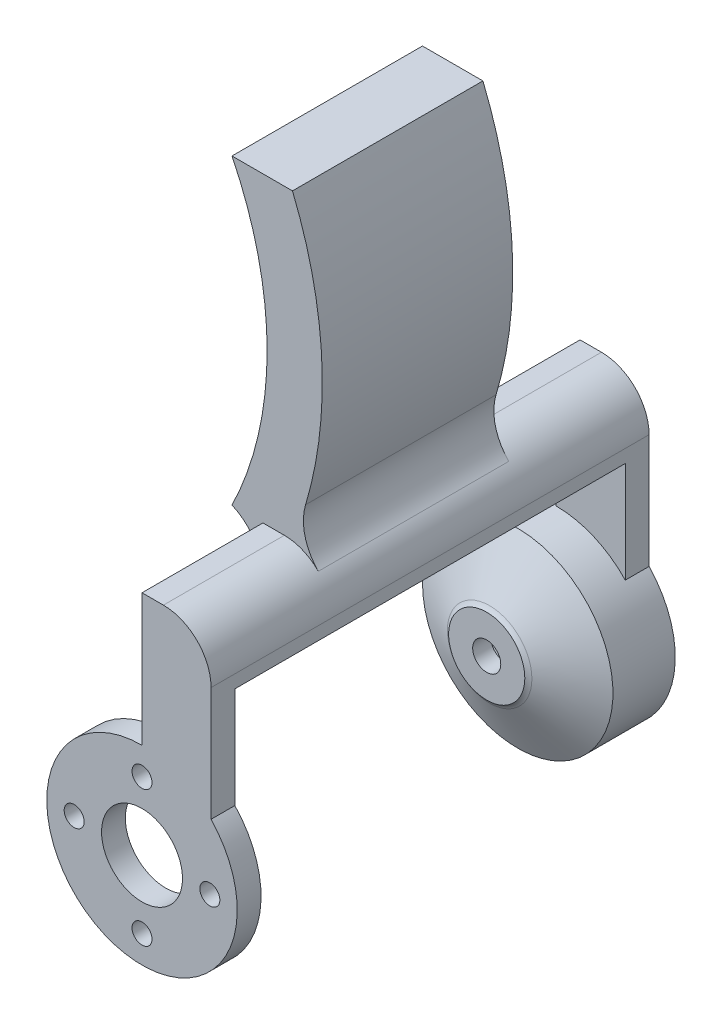
ISO-10303-21;
HEADER;
FILE_DESCRIPTION(('STEP AP214'),'2;1');
FILE_NAME('part.step','',(''),(''),'','','');
FILE_SCHEMA(('AUTOMOTIVE_DESIGN { 1 0 10303 214 1 1 1 1 }'));
ENDSEC;
DATA;
#1=APPLICATION_CONTEXT('core data for automotive mechanical design processes');
#2=APPLICATION_PROTOCOL_DEFINITION('international standard','automotive_design',2000,#1);
#3=PRODUCT_CONTEXT('',#1,'mechanical');
#4=PRODUCT('Part','Part','',(#3));
#5=PRODUCT_RELATED_PRODUCT_CATEGORY('part','',(#4));
#6=PRODUCT_DEFINITION_FORMATION('','',#4);
#7=PRODUCT_DEFINITION_CONTEXT('part definition',#1,'design');
#8=PRODUCT_DEFINITION('design','',#6,#7);
#9=PRODUCT_DEFINITION_SHAPE('','',#8);
#10=(LENGTH_UNIT() NAMED_UNIT(*) SI_UNIT(.MILLI.,.METRE.));
#11=(NAMED_UNIT(*) PLANE_ANGLE_UNIT() SI_UNIT($,.RADIAN.));
#12=(NAMED_UNIT(*) SI_UNIT($,.STERADIAN.) SOLID_ANGLE_UNIT());
#13=UNCERTAINTY_MEASURE_WITH_UNIT(LENGTH_MEASURE(1.E-05),#10,'distance_accuracy_value','');
#14=(GEOMETRIC_REPRESENTATION_CONTEXT(3) GLOBAL_UNCERTAINTY_ASSIGNED_CONTEXT((#13)) GLOBAL_UNIT_ASSIGNED_CONTEXT((#10,
#11,#12)) REPRESENTATION_CONTEXT('',''));
#15=CARTESIAN_POINT('',(0.,0.,0.));
#16=DIRECTION('',(0.,0.,1.));
#17=DIRECTION('',(1.,0.,0.));
#18=AXIS2_PLACEMENT_3D('',#15,#16,#17);
#19=CARTESIAN_POINT('',(0.,-15.875,23.));
#20=DIRECTION('',(0.,1.,0.));
#21=DIRECTION('',(-1.,0.,0.));
#22=AXIS2_PLACEMENT_3D('',#19,#20,#21);
#23=PLANE('',#22);
#24=DIRECTION('',(1.,0.,0.));
#25=VECTOR('',#24,1.);
#26=CARTESIAN_POINT('',(0.,-15.875,23.));
#27=LINE('',#26,#25);
#28=CARTESIAN_POINT('',(0.,-15.875,23.));
#29=VERTEX_POINT('',#28);
#30=CARTESIAN_POINT('',(2.25,-15.875,23.));
#31=VERTEX_POINT('',#30);
#32=EDGE_CURVE('E303',#29,#31,#27,.T.);
#33=ORIENTED_EDGE('',*,*,#32,.T.);
#34=DIRECTION('',(0.,0.,1.));
#35=VECTOR('',#34,1.);
#36=CARTESIAN_POINT('',(2.25,-15.875,23.));
#37=LINE('',#36,#35);
#38=CARTESIAN_POINT('',(2.25,-15.875,10.3));
#39=VERTEX_POINT('',#38);
#40=EDGE_CURVE('E379',#31,#39,#37,.F.);
#41=ORIENTED_EDGE('',*,*,#40,.T.);
#42=DIRECTION('',(1.,0.,0.));
#43=VECTOR('',#42,1.);
#44=CARTESIAN_POINT('',(-3.25,-15.875,10.3));
#45=LINE('',#44,#43);
#46=CARTESIAN_POINT('',(0.,-15.875,10.3));
#47=VERTEX_POINT('',#46);
#48=EDGE_CURVE('E204',#47,#39,#45,.T.);
#49=ORIENTED_EDGE('',*,*,#48,.F.);
#50=DIRECTION('',(0.,0.,-1.));
#51=VECTOR('',#50,1.);
#52=CARTESIAN_POINT('',(0.,-15.875,10.));
#53=LINE('',#52,#51);
#54=EDGE_CURVE('E351',#29,#47,#53,.T.);
#55=ORIENTED_EDGE('',*,*,#54,.F.);
#56=EDGE_LOOP('',(#33,#41,#49,#55));
#57=FACE_BOUND('',#56,.T.);
#58=ADVANCED_FACE('F49',(#57),#23,.T.);
#59=CARTESIAN_POINT('',(0.,-39.7417,-23.));
#60=DIRECTION('',(0.,0.,1.));
#61=DIRECTION('',(1.,0.,0.));
#62=AXIS2_PLACEMENT_3D('',#59,#60,#61);
#63=CYLINDRICAL_SURFACE('',#62,1.475);
#64=CARTESIAN_POINT('',(0.,-39.7417,-13.2));
#65=DIRECTION('',(0.,0.,1.));
#66=DIRECTION('',(1.,0.,0.));
#67=AXIS2_PLACEMENT_3D('',#64,#65,#66);
#68=CIRCLE('',#67,1.475);
#69=CARTESIAN_POINT('',(1.475,-39.7417,-13.2));
#70=VERTEX_POINT('',#69);
#71=EDGE_CURVE('E228',#70,#70,#68,.T.);
#72=ORIENTED_EDGE('',*,*,#71,.T.);
#73=EDGE_LOOP('',(#72));
#74=FACE_BOUND('',#73,.T.);
#75=CARTESIAN_POINT('',(0.,-39.7417,-15.1));
#76=DIRECTION('',(0.,0.,-1.));
#77=DIRECTION('',(-1.,0.,0.));
#78=AXIS2_PLACEMENT_3D('',#75,#76,#77);
#79=CIRCLE('',#78,1.475);
#80=CARTESIAN_POINT('',(-1.475,-39.7417,-15.1));
#81=VERTEX_POINT('',#80);
#82=EDGE_CURVE('E182',#81,#81,#79,.F.);
#83=ORIENTED_EDGE('',*,*,#82,.F.);
#84=EDGE_LOOP('',(#83));
#85=FACE_BOUND('',#84,.T.);
#86=ADVANCED_FACE('F507',(#74,#85),#63,.F.);
#87=CARTESIAN_POINT('',(-25.,-49.7417,-20.5));
#88=DIRECTION('',(0.,0.,-1.));
#89=DIRECTION('',(-1.,0.,0.));
#90=AXIS2_PLACEMENT_3D('',#87,#88,#89);
#91=PLANE('',#90);
#92=CARTESIAN_POINT('',(0.,-39.7417,-20.5));
#93=DIRECTION('',(0.,0.,1.));
#94=DIRECTION('',(1.,0.,0.));
#95=AXIS2_PLACEMENT_3D('',#92,#93,#94);
#96=CIRCLE('',#95,9.99999999999999);
#97=CARTESIAN_POINT('',(7.24999999999999,-32.854211343022,-20.5));
#98=VERTEX_POINT('',#97);
#99=CARTESIAN_POINT('',(0.,-29.7417,-20.5));
#100=VERTEX_POINT('',#99);
#101=EDGE_CURVE('E236',#98,#100,#96,.T.);
#102=ORIENTED_EDGE('',*,*,#101,.F.);
#103=DIRECTION('',(0.,1.,0.));
#104=VECTOR('',#103,1.);
#105=CARTESIAN_POINT('',(7.25,0.,-20.5));
#106=LINE('',#105,#104);
#107=CARTESIAN_POINT('',(7.25,-22.2417,-20.5));
#108=VERTEX_POINT('',#107);
#109=EDGE_CURVE('E274',#98,#108,#106,.T.);
#110=ORIENTED_EDGE('',*,*,#109,.T.);
#111=DIRECTION('',(1.,0.,0.));
#112=VECTOR('',#111,1.);
#113=CARTESIAN_POINT('',(-25.,-22.2417,-20.5));
#114=LINE('',#113,#112);
#115=CARTESIAN_POINT('',(0.,-22.2417,-20.5));
#116=VERTEX_POINT('',#115);
#117=EDGE_CURVE('E239',#116,#108,#114,.T.);
#118=ORIENTED_EDGE('',*,*,#117,.F.);
#119=DIRECTION('',(0.,1.,0.));
#120=VECTOR('',#119,1.);
#121=CARTESIAN_POINT('',(0.,0.,-20.5));
#122=LINE('',#121,#120);
#123=EDGE_CURVE('E278',#100,#116,#122,.T.);
#124=ORIENTED_EDGE('',*,*,#123,.F.);
#125=EDGE_LOOP('',(#102,#110,#118,#124));
#126=FACE_BOUND('',#125,.T.);
#127=ADVANCED_FACE('F463',(#126),#91,.F.);
#128=CARTESIAN_POINT('',(0.,-39.7417,23.));
#129=DIRECTION('',(0.,0.,-1.));
#130=DIRECTION('',(-1.,0.,0.));
#131=AXIS2_PLACEMENT_3D('',#128,#129,#130);
#132=CYLINDRICAL_SURFACE('',#131,10.);
#133=CARTESIAN_POINT('',(0.,-39.7417,-16.4558261025671));
#134=DIRECTION('',(0.,0.,-1.));
#135=DIRECTION('',(-1.,0.,0.));
#136=AXIS2_PLACEMENT_3D('',#133,#134,#135);
#137=CIRCLE('',#136,10.);
#138=CARTESIAN_POINT('',(-10.,-39.7417,-16.4558261025671));
#139=VERTEX_POINT('',#138);
#140=EDGE_CURVE('E207',#139,#139,#137,.T.);
#141=ORIENTED_EDGE('',*,*,#140,.T.);
#142=EDGE_LOOP('',(#141));
#143=FACE_BOUND('',#142,.T.);
#144=DIRECTION('',(0.,0.,-1.));
#145=VECTOR('',#144,1.);
#146=CARTESIAN_POINT('',(7.25,-32.854211343022,23.));
#147=LINE('',#146,#145);
#148=CARTESIAN_POINT('',(7.25,-32.854211343022,-23.));
#149=VERTEX_POINT('',#148);
#150=EDGE_CURVE('E323',#98,#149,#147,.T.);
#151=ORIENTED_EDGE('',*,*,#150,.F.);
#152=ORIENTED_EDGE('',*,*,#101,.T.);
#153=DIRECTION('',(0.,0.,-1.));
#154=VECTOR('',#153,1.);
#155=CARTESIAN_POINT('',(0.,-29.7417,23.));
#156=LINE('',#155,#154);
#157=CARTESIAN_POINT('',(0.,-29.7417,-23.));
#158=VERTEX_POINT('',#157);
#159=EDGE_CURVE('E345',#100,#158,#156,.T.);
#160=ORIENTED_EDGE('',*,*,#159,.T.);
#161=CARTESIAN_POINT('',(0.,-39.7417,-23.));
#162=DIRECTION('',(0.,0.,1.));
#163=DIRECTION('',(1.,0.,0.));
#164=AXIS2_PLACEMENT_3D('',#161,#162,#163);
#165=CIRCLE('',#164,10.);
#166=EDGE_CURVE('E327',#158,#149,#165,.T.);
#167=ORIENTED_EDGE('',*,*,#166,.T.);
#168=EDGE_LOOP('',(#151,#152,#160,#167));
#169=FACE_BOUND('',#168,.T.);
#170=ADVANCED_FACE('F456',(#143,#169),#132,.T.);
#171=CARTESIAN_POINT('',(0.,-39.7417,23.));
#172=DIRECTION('',(0.,0.,-1.));
#173=DIRECTION('',(-1.,0.,0.));
#174=AXIS2_PLACEMENT_3D('',#171,#172,#173);
#175=CYLINDRICAL_SURFACE('',#174,4.25000000000001);
#176=CARTESIAN_POINT('',(0.,-39.7417,-23.));
#177=DIRECTION('',(0.,0.,1.));
#178=DIRECTION('',(1.,0.,0.));
#179=AXIS2_PLACEMENT_3D('',#176,#177,#178);
#180=CIRCLE('',#179,4.25000000000001);
#181=CARTESIAN_POINT('',(4.25000000000001,-39.7417,-23.));
#182=VERTEX_POINT('',#181);
#183=EDGE_CURVE('E292',#182,#182,#180,.T.);
#184=ORIENTED_EDGE('',*,*,#183,.F.);
#185=EDGE_LOOP('',(#184));
#186=FACE_BOUND('',#185,.T.);
#187=CARTESIAN_POINT('',(0.,-39.7417,-15.1));
#188=DIRECTION('',(0.,0.,-1.));
#189=DIRECTION('',(-1.,0.,0.));
#190=AXIS2_PLACEMENT_3D('',#187,#188,#189);
#191=CIRCLE('',#190,4.25000000000001);
#192=CARTESIAN_POINT('',(-4.25,-39.7417,-15.1));
#193=VERTEX_POINT('',#192);
#194=EDGE_CURVE('E198',#193,#193,#191,.F.);
#195=ORIENTED_EDGE('',*,*,#194,.T.);
#196=EDGE_LOOP('',(#195));
#197=FACE_BOUND('',#196,.T.);
#198=ADVANCED_FACE('F493',(#186,#197),#175,.F.);
#199=DIRECTION('',(1.,0.,0.));
#200=VECTOR('',#199,1.);
#201=CARTESIAN_POINT('',(-3.25,-15.875,-9.7));
#202=LINE('',#201,#200);
#203=CARTESIAN_POINT('',(0.,-15.875,-9.7));
#204=VERTEX_POINT('',#203);
#205=CARTESIAN_POINT('',(2.25,-15.875,-9.7));
#206=VERTEX_POINT('',#205);
#207=EDGE_CURVE('E208',#204,#206,#202,.T.);
#208=ORIENTED_EDGE('',*,*,#207,.T.);
#209=DIRECTION('',(0.,0.,1.));
#210=VECTOR('',#209,1.);
#211=CARTESIAN_POINT('',(2.25,-15.875,23.));
#212=LINE('',#211,#210);
#213=CARTESIAN_POINT('',(2.25,-15.875,-23.));
#214=VERTEX_POINT('',#213);
#215=EDGE_CURVE('E376',#206,#214,#212,.F.);
#216=ORIENTED_EDGE('',*,*,#215,.T.);
#217=DIRECTION('',(1.,0.,0.));
#218=VECTOR('',#217,1.);
#219=CARTESIAN_POINT('',(0.,-15.875,-23.));
#220=LINE('',#219,#218);
#221=CARTESIAN_POINT('',(0.,-15.875,-23.));
#222=VERTEX_POINT('',#221);
#223=EDGE_CURVE('E334',#222,#214,#220,.T.);
#224=ORIENTED_EDGE('',*,*,#223,.F.);
#225=EDGE_CURVE('E350',#204,#222,#53,.T.);
#226=ORIENTED_EDGE('',*,*,#225,.F.);
#227=EDGE_LOOP('',(#208,#216,#224,#226));
#228=FACE_BOUND('',#227,.T.);
#229=ADVANCED_FACE('F437',(#228),#23,.T.);
#230=CARTESIAN_POINT('',(0.,0.,23.));
#231=DIRECTION('',(1.,0.,0.));
#232=DIRECTION('',(0.,1.,0.));
#233=AXIS2_PLACEMENT_3D('',#230,#231,#232);
#234=PLANE('',#233);
#235=DIRECTION('',(0.,0.,1.));
#236=VECTOR('',#235,1.);
#237=CARTESIAN_POINT('',(0.,-20.8612310415784,23.));
#238=LINE('',#237,#236);
#239=CARTESIAN_POINT('',(0.,-20.8612310415784,10.3));
#240=VERTEX_POINT('',#239);
#241=CARTESIAN_POINT('',(0.,-20.8612310415784,-9.7));
#242=VERTEX_POINT('',#241);
#243=EDGE_CURVE('E400',#240,#242,#238,.F.);
#244=ORIENTED_EDGE('',*,*,#243,.T.);
#245=DIRECTION('',(0.,1.,0.));
#246=VECTOR('',#245,1.);
#247=CARTESIAN_POINT('',(0.,0.,-9.7));
#248=LINE('',#247,#246);
#249=EDGE_CURVE('E404',#242,#204,#248,.T.);
#250=ORIENTED_EDGE('',*,*,#249,.T.);
#251=ORIENTED_EDGE('',*,*,#225,.T.);
#252=DIRECTION('',(0.,-1.,0.));
#253=VECTOR('',#252,1.);
#254=CARTESIAN_POINT('',(0.,0.,-23.));
#255=LINE('',#254,#253);
#256=EDGE_CURVE('E286',#222,#158,#255,.T.);
#257=ORIENTED_EDGE('',*,*,#256,.T.);
#258=ORIENTED_EDGE('',*,*,#159,.F.);
#259=ORIENTED_EDGE('',*,*,#123,.T.);
#260=DIRECTION('',(0.,0.,1.));
#261=VECTOR('',#260,1.);
#262=CARTESIAN_POINT('',(0.,-22.2417,23.));
#263=LINE('',#262,#261);
#264=CARTESIAN_POINT('',(0.,-22.2417,20.5));
#265=VERTEX_POINT('',#264);
#266=EDGE_CURVE('E282',#116,#265,#263,.T.);
#267=ORIENTED_EDGE('',*,*,#266,.T.);
#268=DIRECTION('',(0.,-1.,0.));
#269=VECTOR('',#268,1.);
#270=CARTESIAN_POINT('',(0.,0.,20.5));
#271=LINE('',#270,#269);
#272=CARTESIAN_POINT('',(0.,-29.7417,20.5));
#273=VERTEX_POINT('',#272);
#274=EDGE_CURVE('E270',#265,#273,#271,.T.);
#275=ORIENTED_EDGE('',*,*,#274,.T.);
#276=CARTESIAN_POINT('',(0.,-29.7417,23.));
#277=VERTEX_POINT('',#276);
#278=EDGE_CURVE('E346',#277,#273,#156,.T.);
#279=ORIENTED_EDGE('',*,*,#278,.F.);
#280=DIRECTION('',(0.,-1.,0.));
#281=VECTOR('',#280,1.);
#282=CARTESIAN_POINT('',(0.,0.,23.));
#283=LINE('',#282,#281);
#284=EDGE_CURVE('E291',#29,#277,#283,.T.);
#285=ORIENTED_EDGE('',*,*,#284,.F.);
#286=ORIENTED_EDGE('',*,*,#54,.T.);
#287=DIRECTION('',(0.,-1.,0.));
#288=VECTOR('',#287,1.);
#289=CARTESIAN_POINT('',(0.,0.,10.3));
#290=LINE('',#289,#288);
#291=EDGE_CURVE('E64',#47,#240,#290,.T.);
#292=ORIENTED_EDGE('',*,*,#291,.T.);
#293=EDGE_LOOP('',(#244,#250,#251,#257,#258,#259,#267,#275,#279,#285,#286,#292));
#294=FACE_BOUND('',#293,.T.);
#295=ADVANCED_FACE('F421',(#294),#234,.F.);
#296=CARTESIAN_POINT('',(0.,-39.7417,20.5));
#297=DIRECTION('',(0.,0.,1.));
#298=DIRECTION('',(0.,-1.,0.));
#299=AXIS2_PLACEMENT_3D('',#296,#297,#298);
#300=CIRCLE('',#299,10.);
#301=CARTESIAN_POINT('',(7.25,-32.854211343022,20.5));
#302=VERTEX_POINT('',#301);
#303=EDGE_CURVE('E267',#273,#302,#300,.T.);
#304=ORIENTED_EDGE('',*,*,#303,.T.);
#305=CARTESIAN_POINT('',(7.25,-32.854211343022,23.));
#306=VERTEX_POINT('',#305);
#307=EDGE_CURVE('E341',#306,#302,#147,.T.);
#308=ORIENTED_EDGE('',*,*,#307,.F.);
#309=CARTESIAN_POINT('',(0.,-39.7417,23.));
#310=DIRECTION('',(0.,0.,1.));
#311=DIRECTION('',(1.,0.,0.));
#312=AXIS2_PLACEMENT_3D('',#309,#310,#311);
#313=CIRCLE('',#312,10.);
#314=EDGE_CURVE('E296',#277,#306,#313,.T.);
#315=ORIENTED_EDGE('',*,*,#314,.F.);
#316=ORIENTED_EDGE('',*,*,#278,.T.);
#317=EDGE_LOOP('',(#304,#308,#315,#316));
#318=FACE_BOUND('',#317,.T.);
#319=ADVANCED_FACE('F472',(#318),#132,.T.);
#320=CARTESIAN_POINT('',(7.25,0.,23.));
#321=DIRECTION('',(1.,0.,0.));
#322=DIRECTION('',(0.,1.,0.));
#323=AXIS2_PLACEMENT_3D('',#320,#321,#322);
#324=PLANE('',#323);
#325=DIRECTION('',(0.,-1.,0.));
#326=VECTOR('',#325,1.);
#327=CARTESIAN_POINT('',(7.25,0.,-23.));
#328=LINE('',#327,#326);
#329=CARTESIAN_POINT('',(7.25,-20.875,-23.));
#330=VERTEX_POINT('',#329);
#331=EDGE_CURVE('E331',#330,#149,#328,.T.);
#332=ORIENTED_EDGE('',*,*,#331,.F.);
#333=DIRECTION('',(0.,0.,1.));
#334=VECTOR('',#333,1.);
#335=CARTESIAN_POINT('',(7.25,-20.875,23.));
#336=LINE('',#335,#334);
#337=CARTESIAN_POINT('',(7.25,-20.875,23.));
#338=VERTEX_POINT('',#337);
#339=EDGE_CURVE('E369',#330,#338,#336,.T.);
#340=ORIENTED_EDGE('',*,*,#339,.T.);
#341=DIRECTION('',(0.,-1.,0.));
#342=VECTOR('',#341,1.);
#343=CARTESIAN_POINT('',(7.25,0.,23.));
#344=LINE('',#343,#342);
#345=EDGE_CURVE('E300',#338,#306,#344,.T.);
#346=ORIENTED_EDGE('',*,*,#345,.T.);
#347=ORIENTED_EDGE('',*,*,#307,.T.);
#348=DIRECTION('',(0.,-1.,0.));
#349=VECTOR('',#348,1.);
#350=CARTESIAN_POINT('',(7.25,0.,20.5));
#351=LINE('',#350,#349);
#352=CARTESIAN_POINT('',(7.25,-22.2417,20.5));
#353=VERTEX_POINT('',#352);
#354=EDGE_CURVE('E263',#353,#302,#351,.T.);
#355=ORIENTED_EDGE('',*,*,#354,.F.);
#356=DIRECTION('',(0.,0.,1.));
#357=VECTOR('',#356,1.);
#358=CARTESIAN_POINT('',(7.25,-22.2417,23.));
#359=LINE('',#358,#357);
#360=EDGE_CURVE('E220',#108,#353,#359,.T.);
#361=ORIENTED_EDGE('',*,*,#360,.F.);
#362=ORIENTED_EDGE('',*,*,#109,.F.);
#363=ORIENTED_EDGE('',*,*,#150,.T.);
#364=EDGE_LOOP('',(#332,#340,#346,#347,#355,#361,#362,#363));
#365=FACE_BOUND('',#364,.T.);
#366=ADVANCED_FACE('F449',(#365),#324,.T.);
#367=CARTESIAN_POINT('',(7.125,-39.7417,23.));
#368=DIRECTION('',(0.,0.,-1.));
#369=DIRECTION('',(-1.,0.,0.));
#370=AXIS2_PLACEMENT_3D('',#367,#368,#369);
#371=CYLINDRICAL_SURFACE('',#370,1.05);
#372=CARTESIAN_POINT('',(7.125,-39.7417,20.5));
#373=DIRECTION('',(0.,0.,1.));
#374=DIRECTION('',(0.,-1.,0.));
#375=AXIS2_PLACEMENT_3D('',#372,#373,#374);
#376=CIRCLE('',#375,1.05);
#377=CARTESIAN_POINT('',(7.125,-40.7917,20.5));
#378=VERTEX_POINT('',#377);
#379=EDGE_CURVE('E259',#378,#378,#376,.T.);
#380=ORIENTED_EDGE('',*,*,#379,.F.);
#381=EDGE_LOOP('',(#380));
#382=FACE_BOUND('',#381,.T.);
#383=CARTESIAN_POINT('',(7.125,-39.7417,23.));
#384=DIRECTION('',(0.,0.,1.));
#385=DIRECTION('',(1.,0.,0.));
#386=AXIS2_PLACEMENT_3D('',#383,#384,#385);
#387=CIRCLE('',#386,1.05);
#388=CARTESIAN_POINT('',(8.175,-39.7417,23.));
#389=VERTEX_POINT('',#388);
#390=EDGE_CURVE('E315',#389,#389,#387,.T.);
#391=ORIENTED_EDGE('',*,*,#390,.T.);
#392=EDGE_LOOP('',(#391));
#393=FACE_BOUND('',#392,.T.);
#394=ADVANCED_FACE('F716',(#382,#393),#371,.F.);
#395=CARTESIAN_POINT('',(0.,-46.8667,23.));
#396=DIRECTION('',(0.,0.,-1.));
#397=DIRECTION('',(-1.,0.,0.));
#398=AXIS2_PLACEMENT_3D('',#395,#396,#397);
#399=CYLINDRICAL_SURFACE('',#398,1.05);
#400=CARTESIAN_POINT('',(0.,-46.8667,20.5));
#401=DIRECTION('',(0.,0.,1.));
#402=DIRECTION('',(0.,-1.,0.));
#403=AXIS2_PLACEMENT_3D('',#400,#401,#402);
#404=CIRCLE('',#403,1.05);
#405=CARTESIAN_POINT('',(0.,-47.9167,20.5));
#406=VERTEX_POINT('',#405);
#407=EDGE_CURVE('E255',#406,#406,#404,.T.);
#408=ORIENTED_EDGE('',*,*,#407,.F.);
#409=EDGE_LOOP('',(#408));
#410=FACE_BOUND('',#409,.T.);
#411=CARTESIAN_POINT('',(0.,-46.8667,23.));
#412=DIRECTION('',(0.,0.,1.));
#413=DIRECTION('',(1.,0.,0.));
#414=AXIS2_PLACEMENT_3D('',#411,#412,#413);
#415=CIRCLE('',#414,1.05);
#416=CARTESIAN_POINT('',(1.05000000000001,-46.8667,23.));
#417=VERTEX_POINT('',#416);
#418=EDGE_CURVE('E311',#417,#417,#415,.T.);
#419=ORIENTED_EDGE('',*,*,#418,.T.);
#420=EDGE_LOOP('',(#419));
#421=FACE_BOUND('',#420,.T.);
#422=ADVANCED_FACE('F708',(#410,#421),#399,.F.);
#423=CARTESIAN_POINT('',(-7.12499999999999,-39.7417,23.));
#424=DIRECTION('',(0.,0.,-1.));
#425=DIRECTION('',(-1.,0.,0.));
#426=AXIS2_PLACEMENT_3D('',#423,#424,#425);
#427=CYLINDRICAL_SURFACE('',#426,1.05);
#428=CARTESIAN_POINT('',(-7.12499999999999,-39.7417,20.5));
#429=DIRECTION('',(0.,0.,1.));
#430=DIRECTION('',(0.,-1.,0.));
#431=AXIS2_PLACEMENT_3D('',#428,#429,#430);
#432=CIRCLE('',#431,1.05);
#433=CARTESIAN_POINT('',(-7.12499999999999,-40.7917,20.5));
#434=VERTEX_POINT('',#433);
#435=EDGE_CURVE('E251',#434,#434,#432,.T.);
#436=ORIENTED_EDGE('',*,*,#435,.F.);
#437=EDGE_LOOP('',(#436));
#438=FACE_BOUND('',#437,.T.);
#439=CARTESIAN_POINT('',(-7.12499999999999,-39.7417,23.));
#440=DIRECTION('',(0.,0.,1.));
#441=DIRECTION('',(1.,0.,0.));
#442=AXIS2_PLACEMENT_3D('',#439,#440,#441);
#443=CIRCLE('',#442,1.05);
#444=CARTESIAN_POINT('',(-6.07499999999999,-39.7417,23.));
#445=VERTEX_POINT('',#444);
#446=EDGE_CURVE('E307',#445,#445,#443,.T.);
#447=ORIENTED_EDGE('',*,*,#446,.T.);
#448=EDGE_LOOP('',(#447));
#449=FACE_BOUND('',#448,.T.);
#450=ADVANCED_FACE('F498',(#438,#449),#427,.F.);
#451=CARTESIAN_POINT('',(0.,-32.6167,23.));
#452=DIRECTION('',(0.,0.,-1.));
#453=DIRECTION('',(-1.,0.,0.));
#454=AXIS2_PLACEMENT_3D('',#451,#452,#453);
#455=CYLINDRICAL_SURFACE('',#454,1.05);
#456=CARTESIAN_POINT('',(0.,-32.6167,20.5));
#457=DIRECTION('',(0.,0.,1.));
#458=DIRECTION('',(0.,-1.,0.));
#459=AXIS2_PLACEMENT_3D('',#456,#457,#458);
#460=CIRCLE('',#459,1.05);
#461=CARTESIAN_POINT('',(0.,-33.6667,20.5));
#462=VERTEX_POINT('',#461);
#463=EDGE_CURVE('E247',#462,#462,#460,.T.);
#464=ORIENTED_EDGE('',*,*,#463,.F.);
#465=EDGE_LOOP('',(#464));
#466=FACE_BOUND('',#465,.T.);
#467=CARTESIAN_POINT('',(0.,-32.6167,23.));
#468=DIRECTION('',(0.,0.,1.));
#469=DIRECTION('',(1.,0.,0.));
#470=AXIS2_PLACEMENT_3D('',#467,#468,#469);
#471=CIRCLE('',#470,1.05);
#472=CARTESIAN_POINT('',(1.05000000000001,-32.6167,23.));
#473=VERTEX_POINT('',#472);
#474=EDGE_CURVE('E287',#473,#473,#471,.T.);
#475=ORIENTED_EDGE('',*,*,#474,.T.);
#476=EDGE_LOOP('',(#475));
#477=FACE_BOUND('',#476,.T.);
#478=ADVANCED_FACE('F490',(#466,#477),#455,.F.);
#479=CARTESIAN_POINT('',(0.,-39.7417,20.5));
#480=DIRECTION('',(0.,0.,1.));
#481=DIRECTION('',(0.,-1.,0.));
#482=AXIS2_PLACEMENT_3D('',#479,#480,#481);
#483=CIRCLE('',#482,4.25000000000001);
#484=CARTESIAN_POINT('',(0.,-43.9917,20.5));
#485=VERTEX_POINT('',#484);
#486=EDGE_CURVE('E244',#485,#485,#483,.T.);
#487=ORIENTED_EDGE('',*,*,#486,.F.);
#488=EDGE_LOOP('',(#487));
#489=FACE_BOUND('',#488,.T.);
#490=CARTESIAN_POINT('',(0.,-39.7417,23.));
#491=DIRECTION('',(0.,0.,1.));
#492=DIRECTION('',(1.,0.,0.));
#493=AXIS2_PLACEMENT_3D('',#490,#491,#492);
#494=CIRCLE('',#493,4.25000000000001);
#495=CARTESIAN_POINT('',(4.25000000000001,-39.7417,23.));
#496=VERTEX_POINT('',#495);
#497=EDGE_CURVE('E319',#496,#496,#494,.T.);
#498=ORIENTED_EDGE('',*,*,#497,.T.);
#499=EDGE_LOOP('',(#498));
#500=FACE_BOUND('',#499,.T.);
#501=ADVANCED_FACE('F477',(#489,#500),#175,.F.);
#502=CARTESIAN_POINT('',(0.,0.,23.));
#503=DIRECTION('',(0.,0.,1.));
#504=DIRECTION('',(1.,0.,0.));
#505=AXIS2_PLACEMENT_3D('',#502,#503,#504);
#506=PLANE('',#505);
#507=ORIENTED_EDGE('',*,*,#345,.F.);
#508=CARTESIAN_POINT('',(2.25,-20.875,23.));
#509=DIRECTION('',(0.,0.,1.));
#510=DIRECTION('',(1.,0.,0.));
#511=AXIS2_PLACEMENT_3D('',#508,#509,#510);
#512=CIRCLE('',#511,5.);
#513=EDGE_CURVE('E373',#338,#31,#512,.T.);
#514=ORIENTED_EDGE('',*,*,#513,.T.);
#515=ORIENTED_EDGE('',*,*,#32,.F.);
#516=ORIENTED_EDGE('',*,*,#284,.T.);
#517=ORIENTED_EDGE('',*,*,#314,.T.);
#518=EDGE_LOOP('',(#507,#514,#515,#516,#517));
#519=FACE_BOUND('',#518,.T.);
#520=ORIENTED_EDGE('',*,*,#474,.F.);
#521=EDGE_LOOP('',(#520));
#522=FACE_BOUND('',#521,.T.);
#523=ORIENTED_EDGE('',*,*,#446,.F.);
#524=EDGE_LOOP('',(#523));
#525=FACE_BOUND('',#524,.T.);
#526=ORIENTED_EDGE('',*,*,#418,.F.);
#527=EDGE_LOOP('',(#526));
#528=FACE_BOUND('',#527,.T.);
#529=ORIENTED_EDGE('',*,*,#390,.F.);
#530=EDGE_LOOP('',(#529));
#531=FACE_BOUND('',#530,.T.);
#532=ORIENTED_EDGE('',*,*,#497,.F.);
#533=EDGE_LOOP('',(#532));
#534=FACE_BOUND('',#533,.T.);
#535=ADVANCED_FACE('F474',(#519,#522,#525,#528,#531,#534),#506,.T.);
#536=CARTESIAN_POINT('',(0.,0.,-23.));
#537=DIRECTION('',(0.,0.,1.));
#538=DIRECTION('',(1.,0.,0.));
#539=AXIS2_PLACEMENT_3D('',#536,#537,#538);
#540=PLANE('',#539);
#541=ORIENTED_EDGE('',*,*,#223,.T.);
#542=CARTESIAN_POINT('',(2.25,-20.875,-23.));
#543=DIRECTION('',(0.,0.,1.));
#544=DIRECTION('',(1.,0.,0.));
#545=AXIS2_PLACEMENT_3D('',#542,#543,#544);
#546=CIRCLE('',#545,5.);
#547=EDGE_CURVE('E382',#214,#330,#546,.F.);
#548=ORIENTED_EDGE('',*,*,#547,.T.);
#549=ORIENTED_EDGE('',*,*,#331,.T.);
#550=ORIENTED_EDGE('',*,*,#166,.F.);
#551=ORIENTED_EDGE('',*,*,#256,.F.);
#552=EDGE_LOOP('',(#541,#548,#549,#550,#551));
#553=FACE_BOUND('',#552,.T.);
#554=ORIENTED_EDGE('',*,*,#183,.T.);
#555=EDGE_LOOP('',(#554));
#556=FACE_BOUND('',#555,.T.);
#557=ADVANCED_FACE('F443',(#553,#556),#540,.F.);
#558=CARTESIAN_POINT('',(-25.,-22.2417,-20.5));
#559=DIRECTION('',(0.,1.,0.));
#560=DIRECTION('',(0.,0.,1.));
#561=AXIS2_PLACEMENT_3D('',#558,#559,#560);
#562=PLANE('',#561);
#563=ORIENTED_EDGE('',*,*,#117,.T.);
#564=ORIENTED_EDGE('',*,*,#360,.T.);
#565=DIRECTION('',(1.,0.,0.));
#566=VECTOR('',#565,1.);
#567=CARTESIAN_POINT('',(-25.,-22.2417,20.5));
#568=LINE('',#567,#566);
#569=EDGE_CURVE('E240',#265,#353,#568,.T.);
#570=ORIENTED_EDGE('',*,*,#569,.F.);
#571=ORIENTED_EDGE('',*,*,#266,.F.);
#572=EDGE_LOOP('',(#563,#564,#570,#571));
#573=FACE_BOUND('',#572,.T.);
#574=ADVANCED_FACE('F465',(#573),#562,.F.);
#575=CARTESIAN_POINT('',(-25.,-49.7417,20.5));
#576=DIRECTION('',(0.,0.,1.));
#577=DIRECTION('',(0.,-1.,0.));
#578=AXIS2_PLACEMENT_3D('',#575,#576,#577);
#579=PLANE('',#578);
#580=ORIENTED_EDGE('',*,*,#379,.T.);
#581=EDGE_LOOP('',(#580));
#582=FACE_BOUND('',#581,.T.);
#583=ORIENTED_EDGE('',*,*,#407,.T.);
#584=EDGE_LOOP('',(#583));
#585=FACE_BOUND('',#584,.T.);
#586=ORIENTED_EDGE('',*,*,#435,.T.);
#587=EDGE_LOOP('',(#586));
#588=FACE_BOUND('',#587,.T.);
#589=ORIENTED_EDGE('',*,*,#463,.T.);
#590=EDGE_LOOP('',(#589));
#591=FACE_BOUND('',#590,.T.);
#592=ORIENTED_EDGE('',*,*,#486,.T.);
#593=EDGE_LOOP('',(#592));
#594=FACE_BOUND('',#593,.T.);
#595=ORIENTED_EDGE('',*,*,#569,.T.);
#596=ORIENTED_EDGE('',*,*,#354,.T.);
#597=ORIENTED_EDGE('',*,*,#303,.F.);
#598=ORIENTED_EDGE('',*,*,#274,.F.);
#599=EDGE_LOOP('',(#595,#596,#597,#598));
#600=FACE_BOUND('',#599,.T.);
#601=ADVANCED_FACE('F469',(#582,#585,#588,#591,#594,#600),#579,.F.);
#602=CARTESIAN_POINT('',(0.,-39.7417,-13.2));
#603=DIRECTION('',(0.,0.,1.));
#604=DIRECTION('',(1.,0.,0.));
#605=AXIS2_PLACEMENT_3D('',#602,#603,#604);
#606=PLANE('',#605);
#607=ORIENTED_EDGE('',*,*,#71,.F.);
#608=EDGE_LOOP('',(#607));
#609=FACE_BOUND('',#608,.T.);
#610=CARTESIAN_POINT('',(0.,-39.7417,-13.2));
#611=DIRECTION('',(0.,0.,1.));
#612=DIRECTION('',(1.,0.,0.));
#613=AXIS2_PLACEMENT_3D('',#610,#611,#612);
#614=CIRCLE('',#613,4.);
#615=CARTESIAN_POINT('',(4.,-39.7417,-13.2));
#616=VERTEX_POINT('',#615);
#617=EDGE_CURVE('E232',#616,#616,#614,.T.);
#618=ORIENTED_EDGE('',*,*,#617,.T.);
#619=EDGE_LOOP('',(#618));
#620=FACE_BOUND('',#619,.T.);
#621=ADVANCED_FACE('F623',(#609,#620),#606,.T.);
#622=CARTESIAN_POINT('',(0.,-39.7417,-15.1));
#623=DIRECTION('',(0.,0.,-1.));
#624=DIRECTION('',(-1.,0.,0.));
#625=AXIS2_PLACEMENT_3D('',#622,#623,#624);
#626=PLANE('',#625);
#627=ORIENTED_EDGE('',*,*,#82,.T.);
#628=EDGE_LOOP('',(#627));
#629=FACE_BOUND('',#628,.T.);
#630=ORIENTED_EDGE('',*,*,#194,.F.);
#631=EDGE_LOOP('',(#630));
#632=FACE_BOUND('',#631,.T.);
#633=ADVANCED_FACE('F615',(#629,#632),#626,.T.);
#634=CARTESIAN_POINT('',(-3.25,15.875,-9.7));
#635=DIRECTION('',(0.,-1.,0.));
#636=DIRECTION('',(0.,0.,-1.));
#637=AXIS2_PLACEMENT_3D('',#634,#635,#636);
#638=PLANE('',#637);
#639=DIRECTION('',(0.,0.,1.));
#640=VECTOR('',#639,1.);
#641=CARTESIAN_POINT('',(-3.25,15.875,-9.7));
#642=LINE('',#641,#640);
#643=CARTESIAN_POINT('',(-3.25,15.875,-9.7));
#644=VERTEX_POINT('',#643);
#645=CARTESIAN_POINT('',(-3.25,15.875,10.3));
#646=VERTEX_POINT('',#645);
#647=EDGE_CURVE('E195',#644,#646,#642,.T.);
#648=ORIENTED_EDGE('',*,*,#647,.T.);
#649=DIRECTION('',(1.,0.,0.));
#650=VECTOR('',#649,1.);
#651=CARTESIAN_POINT('',(-3.25,15.875,10.3));
#652=LINE('',#651,#650);
#653=CARTESIAN_POINT('',(3.1,15.875,10.3));
#654=VERTEX_POINT('',#653);
#655=EDGE_CURVE('E188',#646,#654,#652,.T.);
#656=ORIENTED_EDGE('',*,*,#655,.T.);
#657=DIRECTION('',(0.,0.,1.));
#658=VECTOR('',#657,1.);
#659=CARTESIAN_POINT('',(3.1,15.875,-9.7));
#660=LINE('',#659,#658);
#661=CARTESIAN_POINT('',(3.1,15.875,-9.7));
#662=VERTEX_POINT('',#661);
#663=EDGE_CURVE('E169',#662,#654,#660,.T.);
#664=ORIENTED_EDGE('',*,*,#663,.F.);
#665=DIRECTION('',(1.,0.,0.));
#666=VECTOR('',#665,1.);
#667=CARTESIAN_POINT('',(-3.25,15.875,-9.7));
#668=LINE('',#667,#666);
#669=EDGE_CURVE('E211',#644,#662,#668,.T.);
#670=ORIENTED_EDGE('',*,*,#669,.F.);
#671=EDGE_LOOP('',(#648,#656,#664,#670));
#672=FACE_BOUND('',#671,.T.);
#673=ADVANCED_FACE('F194',(#672),#638,.F.);
#674=CARTESIAN_POINT('',(-35.5607470510974,0.,-9.7));
#675=DIRECTION('',(0.,0.,1.));
#676=DIRECTION('',(1.,0.,0.));
#677=AXIS2_PLACEMENT_3D('',#674,#675,#676);
#678=CYLINDRICAL_SURFACE('',#677,41.793169149383);
#679=CARTESIAN_POINT('',(-35.5607470510974,0.,10.3));
#680=DIRECTION('',(0.,0.,-1.));
#681=DIRECTION('',(-1.,0.,0.));
#682=AXIS2_PLACEMENT_3D('',#679,#680,#681);
#683=CIRCLE('',#682,41.793169149383);
#684=CARTESIAN_POINT('',(4.47765459454122,-11.9831290242348,10.3));
#685=VERTEX_POINT('',#684);
#686=EDGE_CURVE('E173',#654,#685,#683,.T.);
#687=ORIENTED_EDGE('',*,*,#686,.T.);
#688=DIRECTION('',(0.,0.,1.));
#689=VECTOR('',#688,1.);
#690=CARTESIAN_POINT('',(4.47765459454123,-11.9831290242348,-9.7));
#691=LINE('',#690,#689);
#692=CARTESIAN_POINT('',(4.47765459454122,-11.9831290242348,-9.7));
#693=VERTEX_POINT('',#692);
#694=EDGE_CURVE('E391',#685,#693,#691,.F.);
#695=ORIENTED_EDGE('',*,*,#694,.T.);
#696=CARTESIAN_POINT('',(-35.5607470510974,0.,-9.7));
#697=DIRECTION('',(0.,0.,-1.));
#698=DIRECTION('',(-1.,0.,0.));
#699=AXIS2_PLACEMENT_3D('',#696,#697,#698);
#700=CIRCLE('',#699,41.793169149383);
#701=EDGE_CURVE('E176',#662,#693,#700,.T.);
#702=ORIENTED_EDGE('',*,*,#701,.F.);
#703=ORIENTED_EDGE('',*,*,#663,.T.);
#704=EDGE_LOOP('',(#687,#695,#702,#703));
#705=FACE_BOUND('',#704,.T.);
#706=ADVANCED_FACE('F171',(#705),#678,.T.);
#707=CARTESIAN_POINT('',(-35.5607470510974,0.,-9.7));
#708=DIRECTION('',(0.,0.,1.));
#709=DIRECTION('',(1.,0.,0.));
#710=AXIS2_PLACEMENT_3D('',#707,#708,#709);
#711=CYLINDRICAL_SURFACE('',#710,36.);
#712=DIRECTION('',(0.,0.,1.));
#713=VECTOR('',#712,1.);
#714=CARTESIAN_POINT('',(-3.25,-15.875,-9.7));
#715=LINE('',#714,#713);
#716=CARTESIAN_POINT('',(-3.25,-15.875,-9.7));
#717=VERTEX_POINT('',#716);
#718=CARTESIAN_POINT('',(-3.25,-15.875,10.3));
#719=VERTEX_POINT('',#718);
#720=EDGE_CURVE('E183',#717,#719,#715,.T.);
#721=ORIENTED_EDGE('',*,*,#720,.T.);
#722=CARTESIAN_POINT('',(-35.5607470510974,0.,10.3));
#723=DIRECTION('',(0.,0.,-1.));
#724=DIRECTION('',(-1.,0.,0.));
#725=AXIS2_PLACEMENT_3D('',#722,#723,#724);
#726=CIRCLE('',#725,36.);
#727=EDGE_CURVE('E192',#646,#719,#726,.T.);
#728=ORIENTED_EDGE('',*,*,#727,.F.);
#729=ORIENTED_EDGE('',*,*,#647,.F.);
#730=CARTESIAN_POINT('',(-35.5607470510974,0.,-9.7));
#731=DIRECTION('',(0.,0.,-1.));
#732=DIRECTION('',(-1.,0.,0.));
#733=AXIS2_PLACEMENT_3D('',#730,#731,#732);
#734=CIRCLE('',#733,36.);
#735=EDGE_CURVE('E216',#644,#717,#734,.T.);
#736=ORIENTED_EDGE('',*,*,#735,.T.);
#737=EDGE_LOOP('',(#721,#728,#729,#736));
#738=FACE_BOUND('',#737,.T.);
#739=ADVANCED_FACE('F418',(#738),#711,.F.);
#740=CARTESIAN_POINT('',(-35.5607470510974,0.,-9.7));
#741=DIRECTION('',(0.,0.,-1.));
#742=DIRECTION('',(-1.,0.,0.));
#743=AXIS2_PLACEMENT_3D('',#740,#741,#742);
#744=PLANE('',#743);
#745=ORIENTED_EDGE('',*,*,#669,.T.);
#746=ORIENTED_EDGE('',*,*,#701,.T.);
#747=CARTESIAN_POINT('',(9.69882574307931,-13.5457780051878,-9.7));
#748=DIRECTION('',(0.,0.,-1.));
#749=DIRECTION('',(-1.,0.,0.));
#750=AXIS2_PLACEMENT_3D('',#747,#748,#749);
#751=CIRCLE('',#750,5.45);
#752=CARTESIAN_POINT('',(5.81403145601882,-17.3681952177932,-9.7));
#753=VERTEX_POINT('',#752);
#754=EDGE_CURVE('E407',#693,#753,#751,.F.);
#755=ORIENTED_EDGE('',*,*,#754,.T.);
#756=CARTESIAN_POINT('',(2.25,-20.875,-9.7));
#757=DIRECTION('',(0.,0.,-1.));
#758=DIRECTION('',(-1.,0.,0.));
#759=AXIS2_PLACEMENT_3D('',#756,#757,#758);
#760=CIRCLE('',#759,5.);
#761=EDGE_CURVE('E388',#753,#206,#760,.F.);
#762=ORIENTED_EDGE('',*,*,#761,.T.);
#763=ORIENTED_EDGE('',*,*,#207,.F.);
#764=ORIENTED_EDGE('',*,*,#249,.F.);
#765=CARTESIAN_POINT('',(-5.45,-20.8612310415784,-9.7));
#766=DIRECTION('',(0.,0.,-1.));
#767=DIRECTION('',(-1.,0.,0.));
#768=AXIS2_PLACEMENT_3D('',#765,#766,#767);
#769=CIRCLE('',#768,5.45);
#770=EDGE_CURVE('E58',#242,#717,#769,.F.);
#771=ORIENTED_EDGE('',*,*,#770,.T.);
#772=ORIENTED_EDGE('',*,*,#735,.F.);
#773=EDGE_LOOP('',(#745,#746,#755,#762,#763,#764,#771,#772));
#774=FACE_BOUND('',#773,.T.);
#775=ADVANCED_FACE('F415',(#774),#744,.T.);
#776=CARTESIAN_POINT('',(-35.5607470510974,0.,10.3));
#777=DIRECTION('',(0.,0.,-1.));
#778=DIRECTION('',(-1.,0.,0.));
#779=AXIS2_PLACEMENT_3D('',#776,#777,#778);
#780=PLANE('',#779);
#781=ORIENTED_EDGE('',*,*,#655,.F.);
#782=ORIENTED_EDGE('',*,*,#727,.T.);
#783=CARTESIAN_POINT('',(-5.45,-20.8612310415784,10.3));
#784=DIRECTION('',(0.,0.,-1.));
#785=DIRECTION('',(-1.,0.,0.));
#786=AXIS2_PLACEMENT_3D('',#783,#784,#785);
#787=CIRCLE('',#786,5.45);
#788=EDGE_CURVE('E11',#719,#240,#787,.T.);
#789=ORIENTED_EDGE('',*,*,#788,.T.);
#790=ORIENTED_EDGE('',*,*,#291,.F.);
#791=ORIENTED_EDGE('',*,*,#48,.T.);
#792=CARTESIAN_POINT('',(2.25,-20.875,10.3));
#793=DIRECTION('',(0.,0.,-1.));
#794=DIRECTION('',(-1.,0.,0.));
#795=AXIS2_PLACEMENT_3D('',#792,#793,#794);
#796=CIRCLE('',#795,5.);
#797=CARTESIAN_POINT('',(5.81403145601882,-17.3681952177932,10.3));
#798=VERTEX_POINT('',#797);
#799=EDGE_CURVE('E385',#39,#798,#796,.T.);
#800=ORIENTED_EDGE('',*,*,#799,.T.);
#801=CARTESIAN_POINT('',(9.69882574307931,-13.5457780051878,10.3));
#802=DIRECTION('',(0.,0.,-1.));
#803=DIRECTION('',(-1.,0.,0.));
#804=AXIS2_PLACEMENT_3D('',#801,#802,#803);
#805=CIRCLE('',#804,5.45);
#806=EDGE_CURVE('E190',#798,#685,#805,.T.);
#807=ORIENTED_EDGE('',*,*,#806,.T.);
#808=ORIENTED_EDGE('',*,*,#686,.F.);
#809=EDGE_LOOP('',(#781,#782,#789,#790,#791,#800,#807,#808));
#810=FACE_BOUND('',#809,.T.);
#811=ADVANCED_FACE('F186',(#810),#780,.F.);
#812=CARTESIAN_POINT('',(0.,-39.7417,-13.3259710170945));
#813=DIRECTION('',(0.,0.,-1.));
#814=DIRECTION('',(-1.,0.,0.));
#815=AXIS2_PLACEMENT_3D('',#812,#813,#814);
#816=CONICAL_SURFACE('',#815,4.08617908189938,1.08402802996173);
#817=CARTESIAN_POINT('',(0.,-39.7417,-13.5098849641895));
#818=DIRECTION('',(0.,0.,-1.));
#819=DIRECTION('',(-1.,0.,0.));
#820=AXIS2_PLACEMENT_3D('',#817,#818,#819);
#821=CIRCLE('',#820,4.43368211886388);
#822=CARTESIAN_POINT('',(-4.43368211886388,-39.7417,-13.5098849641895));
#823=VERTEX_POINT('',#822);
#824=EDGE_CURVE('E365',#823,#823,#821,.T.);
#825=CARTESIAN_POINT('',(-4.43368211886388,-39.7417,-13.5098849641895));
#826=CARTESIAN_POINT('',(-4.49166459679238,-39.7417,-13.5405718510476));
#827=CARTESIAN_POINT('',(-4.54964707472088,-39.7417,-13.5712587379057));
#828=CARTESIAN_POINT('',(-4.66561203057788,-39.7417,-13.6326325116219));
#829=CARTESIAN_POINT('',(-4.72359450850638,-39.7417,-13.66331939848));
#830=CARTESIAN_POINT('',(-4.83955946436339,-39.7417,-13.7246931721962));
#831=CARTESIAN_POINT('',(-4.89754194229189,-39.7417,-13.7553800590543));
#832=CARTESIAN_POINT('',(-5.01350689814889,-39.7417,-13.8167538327705));
#833=CARTESIAN_POINT('',(-5.07148937607739,-39.7417,-13.8474407196286));
#834=CARTESIAN_POINT('',(-5.18745433193439,-39.7417,-13.9088144933448));
#835=CARTESIAN_POINT('',(-5.24543680986289,-39.7417,-13.9395013802029));
#836=CARTESIAN_POINT('',(-5.3614017657199,-39.7417,-14.0008751539191));
#837=CARTESIAN_POINT('',(-5.4193842436484,-39.7417,-14.0315620407772));
#838=CARTESIAN_POINT('',(-5.5353491995054,-39.7417,-14.0929358144934));
#839=CARTESIAN_POINT('',(-5.5933316774339,-39.7417,-14.1236227013515));
#840=CARTESIAN_POINT('',(-5.70929663329091,-39.7417,-14.1849964750677));
#841=CARTESIAN_POINT('',(-5.76727911121941,-39.7417,-14.2156833619258));
#842=CARTESIAN_POINT('',(-5.88324406707641,-39.7417,-14.277057135642));
#843=CARTESIAN_POINT('',(-5.94122654500491,-39.7417,-14.3077440225001));
#844=CARTESIAN_POINT('',(-6.05719150086191,-39.7417,-14.3691177962163));
#845=CARTESIAN_POINT('',(-6.11517397879041,-39.7417,-14.3998046830744));
#846=CARTESIAN_POINT('',(-6.23113893464742,-39.7417,-14.4611784567906));
#847=CARTESIAN_POINT('',(-6.28912141257592,-39.7417,-14.4918653436487));
#848=CARTESIAN_POINT('',(-6.40508636843292,-39.7417,-14.5532391173649));
#849=CARTESIAN_POINT('',(-6.46306884636142,-39.7417,-14.583926004223));
#850=CARTESIAN_POINT('',(-6.57903380221842,-39.7417,-14.6452997779392));
#851=CARTESIAN_POINT('',(-6.63701628014692,-39.7417,-14.6759866647973));
#852=CARTESIAN_POINT('',(-6.75298123600393,-39.7417,-14.7373604385135));
#853=CARTESIAN_POINT('',(-6.81096371393243,-39.7417,-14.7680473253716));
#854=CARTESIAN_POINT('',(-6.92692866978943,-39.7417,-14.8294210990878));
#855=CARTESIAN_POINT('',(-6.98491114771793,-39.7417,-14.8601079859459));
#856=CARTESIAN_POINT('',(-7.10087610357493,-39.7417,-14.9214817596621));
#857=CARTESIAN_POINT('',(-7.15885858150344,-39.7417,-14.9521686465202));
#858=CARTESIAN_POINT('',(-7.27482353736044,-39.7417,-15.0135424202364));
#859=CARTESIAN_POINT('',(-7.33280601528894,-39.7417,-15.0442293070945));
#860=CARTESIAN_POINT('',(-7.44877097114594,-39.7417,-15.1056030808107));
#861=CARTESIAN_POINT('',(-7.50675344907444,-39.7417,-15.1362899676688));
#862=CARTESIAN_POINT('',(-7.62271840493145,-39.7417,-15.197663741385));
#863=CARTESIAN_POINT('',(-7.68070088285995,-39.7417,-15.2283506282431));
#864=CARTESIAN_POINT('',(-7.79666583871695,-39.7417,-15.2897244019593));
#865=CARTESIAN_POINT('',(-7.85464831664545,-39.7417,-15.3204112888174));
#866=CARTESIAN_POINT('',(-7.97061327250245,-39.7417,-15.3817850625336));
#867=CARTESIAN_POINT('',(-8.02859575043096,-39.7417,-15.4124719493917));
#868=CARTESIAN_POINT('',(-8.14456070628796,-39.7417,-15.4738457231079));
#869=CARTESIAN_POINT('',(-8.20254318421646,-39.7417,-15.504532609966));
#870=CARTESIAN_POINT('',(-8.31850814007346,-39.7417,-15.5659063836822));
#871=CARTESIAN_POINT('',(-8.37649061800196,-39.7417,-15.5965932705403));
#872=CARTESIAN_POINT('',(-8.49245557385897,-39.7417,-15.6579670442565));
#873=CARTESIAN_POINT('',(-8.55043805178747,-39.7417,-15.6886539311146));
#874=CARTESIAN_POINT('',(-8.66640300764447,-39.7417,-15.7500277048308));
#875=CARTESIAN_POINT('',(-8.72438548557297,-39.7417,-15.7807145916889));
#876=CARTESIAN_POINT('',(-8.84035044142997,-39.7417,-15.8420883654051));
#877=CARTESIAN_POINT('',(-8.89833291935848,-39.7417,-15.8727752522632));
#878=CARTESIAN_POINT('',(-9.01429787521548,-39.7417,-15.9341490259794));
#879=CARTESIAN_POINT('',(-9.07228035314398,-39.7417,-15.9648359128375));
#880=CARTESIAN_POINT('',(-9.18824530900098,-39.7417,-16.0262096865537));
#881=CARTESIAN_POINT('',(-9.24622778692948,-39.7417,-16.0568965734118));
#882=CARTESIAN_POINT('',(-9.36219274278649,-39.7417,-16.118270347128));
#883=CARTESIAN_POINT('',(-9.42017522071499,-39.7417,-16.1489572339861));
#884=CARTESIAN_POINT('',(-9.53614017657199,-39.7417,-16.2103310077023));
#885=CARTESIAN_POINT('',(-9.59412265450049,-39.7417,-16.2410178945604));
#886=CARTESIAN_POINT('',(-9.71008761035749,-39.7417,-16.3023916682766));
#887=CARTESIAN_POINT('',(-9.768070088286,-39.7417,-16.3330785551347));
#888=CARTESIAN_POINT('',(-9.884035044143,-39.7417,-16.3944523288509));
#889=CARTESIAN_POINT('',(-9.9420175220715,-39.7417,-16.425139215709));
#890=CARTESIAN_POINT('',(-10.,-39.7417,-16.4558261025671));
#891=B_SPLINE_CURVE_WITH_KNOTS('',3,(#825,#826,#827,#828,#829,#830,#831,#832,#833,#834,#835,
#836,#837,#838,#839,#840,#841,#842,#843,#844,#845,#846,#847,#848,#849,#850,#851,#852,#853,#854,
#855,#856,#857,#858,#859,#860,#861,#862,#863,#864,#865,#866,#867,#868,#869,#870,#871,#872,#873,
#874,#875,#876,#877,#878,#879,#880,#881,#882,#883,#884,#885,#886,#887,#888,#889,#890),
.UNSPECIFIED.,.F.,.F.,(4,2,2,2,2,2,2,2,2,2,2,2,2,2,2,2,2,2,2,2,2,2,2,2,2,2,2,2,2,2,2,2,4),(0.,
0.196806694362614,0.393613388725227,0.590420083087841,0.787226777450453,0.984033471813068,
1.18084016617568,1.37764686053829,1.57445355490091,1.77126024926352,1.96806694362613,
2.16487363798875,2.36168033235136,2.55848702671397,2.75529372107659,2.9521004154392,
3.14890710980182,3.34571380416443,3.54252049852704,3.73932719288966,3.93613388725227,
4.13294058161488,4.3297472759775,4.52655397034011,4.72336066470272,4.92016735906534,
5.11697405342795,5.31378074779056,5.51058744215318,5.70739413651579,5.90420083087841,
6.10100752524102,6.29781421960363),.UNSPECIFIED.);
#892=EDGE_CURVE('BSEAM531',#823,#139,#891,.T.);
#893=ORIENTED_EDGE('',*,*,#824,.T.);
#894=ORIENTED_EDGE('',*,*,#140,.F.);
#895=ORIENTED_EDGE('',*,*,#892,.T.);
#896=ORIENTED_EDGE('',*,*,#892,.F.);
#897=EDGE_LOOP('',(#893,#895,#894,#896));
#898=FACE_BOUND('',#897,.T.);
#899=ADVANCED_FACE('F531',(#898),#816,.T.);
#900=CARTESIAN_POINT('',(0.,-39.7417,-11.7421866209105));
#901=DIRECTION('',(0.,0.,1.));
#902=DIRECTION('',(1.,0.,0.));
#903=AXIS2_PLACEMENT_3D('',#900,#901,#902);
#904=TOROIDAL_SURFACE('',#903,5.3692261141782,2.);
#905=ORIENTED_EDGE('',*,*,#824,.F.);
#906=EDGE_LOOP('',(#905));
#907=FACE_BOUND('',#906,.T.);
#908=ORIENTED_EDGE('',*,*,#617,.F.);
#909=EDGE_LOOP('',(#908));
#910=FACE_BOUND('',#909,.T.);
#911=ADVANCED_FACE('F536',(#907,#910),#904,.F.);
#912=CARTESIAN_POINT('',(2.25,-20.875,23.));
#913=DIRECTION('',(0.,0.,1.));
#914=DIRECTION('',(1.,0.,0.));
#915=AXIS2_PLACEMENT_3D('',#912,#913,#914);
#916=CYLINDRICAL_SURFACE('',#915,5.);
#917=ORIENTED_EDGE('',*,*,#761,.F.);
#918=DIRECTION('',(0.,0.,1.));
#919=VECTOR('',#918,1.);
#920=CARTESIAN_POINT('',(5.81403145601882,-17.3681952177932,23.));
#921=LINE('',#920,#919);
#922=EDGE_CURVE('E394',#753,#798,#921,.T.);
#923=ORIENTED_EDGE('',*,*,#922,.T.);
#924=ORIENTED_EDGE('',*,*,#799,.F.);
#925=ORIENTED_EDGE('',*,*,#40,.F.);
#926=ORIENTED_EDGE('',*,*,#513,.F.);
#927=ORIENTED_EDGE('',*,*,#339,.F.);
#928=ORIENTED_EDGE('',*,*,#547,.F.);
#929=ORIENTED_EDGE('',*,*,#215,.F.);
#930=EDGE_LOOP('',(#917,#923,#924,#925,#926,#927,#928,#929));
#931=FACE_BOUND('',#930,.T.);
#932=ADVANCED_FACE('F430',(#931),#916,.T.);
#933=CARTESIAN_POINT('',(9.69882574307931,-13.5457780051878,23.));
#934=DIRECTION('',(0.,0.,1.));
#935=DIRECTION('',(1.,0.,0.));
#936=AXIS2_PLACEMENT_3D('',#933,#934,#935);
#937=CYLINDRICAL_SURFACE('',#936,5.45);
#938=ORIENTED_EDGE('',*,*,#806,.F.);
#939=ORIENTED_EDGE('',*,*,#922,.F.);
#940=ORIENTED_EDGE('',*,*,#754,.F.);
#941=ORIENTED_EDGE('',*,*,#694,.F.);
#942=EDGE_LOOP('',(#938,#939,#940,#941));
#943=FACE_BOUND('',#942,.T.);
#944=ADVANCED_FACE('F434',(#943),#937,.F.);
#945=CARTESIAN_POINT('',(-5.45,-20.8612310415784,-9.7));
#946=DIRECTION('',(0.,0.,1.));
#947=DIRECTION('',(1.,0.,0.));
#948=AXIS2_PLACEMENT_3D('',#945,#946,#947);
#949=CYLINDRICAL_SURFACE('',#948,5.45);
#950=ORIENTED_EDGE('',*,*,#788,.F.);
#951=ORIENTED_EDGE('',*,*,#720,.F.);
#952=ORIENTED_EDGE('',*,*,#770,.F.);
#953=ORIENTED_EDGE('',*,*,#243,.F.);
#954=EDGE_LOOP('',(#950,#951,#952,#953));
#955=FACE_BOUND('',#954,.T.);
#956=ADVANCED_FACE('F51',(#955),#949,.F.);
#957=CLOSED_SHELL('',(#58,#86,#127,#170,#198,#229,#295,#319,#366,#394,#422,#450,#478,#501,#535,
#557,#574,#601,#621,#633,#673,#706,#739,#775,#811,#899,#911,#932,#944,#956));
#958=MANIFOLD_SOLID_BREP('B2',#957);
#959=ADVANCED_BREP_SHAPE_REPRESENTATION('',(#18,#958),#14);
#960=SHAPE_DEFINITION_REPRESENTATION(#9,#959);
ENDSEC;
END-ISO-10303-21;
